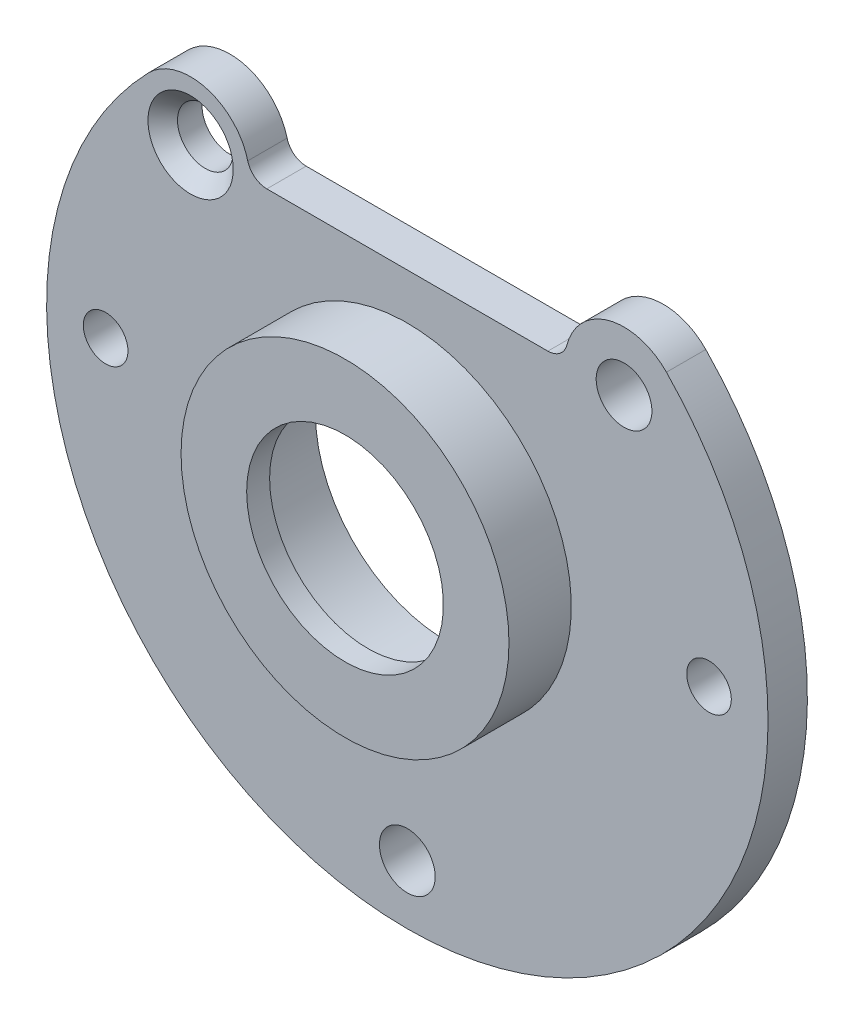
ISO-10303-21;
HEADER;
FILE_DESCRIPTION(('STEP AP214'),'2;1');
FILE_NAME('part.step','',(''),(''),'','','');
FILE_SCHEMA(('AUTOMOTIVE_DESIGN { 1 0 10303 214 1 1 1 1 }'));
ENDSEC;
DATA;
#1=APPLICATION_CONTEXT('core data for automotive mechanical design processes');
#2=APPLICATION_PROTOCOL_DEFINITION('international standard','automotive_design',2000,#1);
#3=PRODUCT_CONTEXT('',#1,'mechanical');
#4=PRODUCT('Part','Part','',(#3));
#5=PRODUCT_RELATED_PRODUCT_CATEGORY('part','',(#4));
#6=PRODUCT_DEFINITION_FORMATION('','',#4);
#7=PRODUCT_DEFINITION_CONTEXT('part definition',#1,'design');
#8=PRODUCT_DEFINITION('design','',#6,#7);
#9=PRODUCT_DEFINITION_SHAPE('','',#8);
#10=(LENGTH_UNIT() NAMED_UNIT(*) SI_UNIT(.MILLI.,.METRE.));
#11=(NAMED_UNIT(*) PLANE_ANGLE_UNIT() SI_UNIT($,.RADIAN.));
#12=(NAMED_UNIT(*) SI_UNIT($,.STERADIAN.) SOLID_ANGLE_UNIT());
#13=UNCERTAINTY_MEASURE_WITH_UNIT(LENGTH_MEASURE(1.E-05),#10,'distance_accuracy_value','');
#14=(GEOMETRIC_REPRESENTATION_CONTEXT(3) GLOBAL_UNCERTAINTY_ASSIGNED_CONTEXT((#13)) GLOBAL_UNIT_ASSIGNED_CONTEXT((#10,
#11,#12)) REPRESENTATION_CONTEXT('',''));
#15=CARTESIAN_POINT('',(0.,0.,0.));
#16=DIRECTION('',(0.,0.,1.));
#17=DIRECTION('',(1.,0.,0.));
#18=AXIS2_PLACEMENT_3D('',#15,#16,#17);
#19=CARTESIAN_POINT('',(-33.0454232837166,32.,6.));
#20=DIRECTION('',(0.,0.,-1.));
#21=DIRECTION('',(-1.,0.,0.));
#22=AXIS2_PLACEMENT_3D('',#19,#20,#21);
#23=PLANE('',#22);
#24=CARTESIAN_POINT('',(-33.0454232837166,32.,6.));
#25=DIRECTION('',(0.,0.,1.));
#26=DIRECTION('',(1.,0.,0.));
#27=AXIS2_PLACEMENT_3D('',#24,#25,#26);
#28=CIRCLE('',#27,6.5);
#29=CARTESIAN_POINT('',(-26.5454232837166,32.,6.));
#30=VERTEX_POINT('',#29);
#31=EDGE_CURVE('E257',#30,#30,#28,.T.);
#32=ORIENTED_EDGE('',*,*,#31,.F.);
#33=EDGE_LOOP('',(#32));
#34=FACE_BOUND('',#33,.T.);
#35=CARTESIAN_POINT('',(46.,0.,6.));
#36=DIRECTION('',(0.,0.,1.));
#37=DIRECTION('',(1.,0.,0.));
#38=AXIS2_PLACEMENT_3D('',#35,#36,#37);
#39=CIRCLE('',#38,3.39999999999999);
#40=CARTESIAN_POINT('',(49.4,0.,6.));
#41=VERTEX_POINT('',#40);
#42=EDGE_CURVE('E264',#41,#41,#39,.T.);
#43=ORIENTED_EDGE('',*,*,#42,.F.);
#44=EDGE_LOOP('',(#43));
#45=FACE_BOUND('',#44,.T.);
#46=CARTESIAN_POINT('',(0.,-46.,6.));
#47=DIRECTION('',(0.,0.,1.));
#48=DIRECTION('',(1.,0.,0.));
#49=AXIS2_PLACEMENT_3D('',#46,#47,#48);
#50=CIRCLE('',#49,4.25000000000001);
#51=CARTESIAN_POINT('',(4.25000000000001,-46.,6.));
#52=VERTEX_POINT('',#51);
#53=EDGE_CURVE('E152',#52,#52,#50,.T.);
#54=ORIENTED_EDGE('',*,*,#53,.F.);
#55=EDGE_LOOP('',(#54));
#56=FACE_BOUND('',#55,.T.);
#57=CARTESIAN_POINT('',(0.,0.,6.));
#58=DIRECTION('',(0.,0.,-1.));
#59=DIRECTION('',(-1.,0.,0.));
#60=AXIS2_PLACEMENT_3D('',#57,#58,#59);
#61=CIRCLE('',#60,25.);
#62=CARTESIAN_POINT('',(-25.,0.,6.));
#63=VERTEX_POINT('',#62);
#64=EDGE_CURVE('E11',#63,#63,#61,.F.);
#65=ORIENTED_EDGE('',*,*,#64,.F.);
#66=EDGE_LOOP('',(#65));
#67=FACE_BOUND('',#66,.T.);
#68=CARTESIAN_POINT('',(-33.0454232837166,32.,6.));
#69=DIRECTION('',(0.,0.,1.));
#70=DIRECTION('',(-1.,0.,0.));
#71=AXIS2_PLACEMENT_3D('',#68,#69,#70);
#72=CIRCLE('',#71,9.);
#73=CARTESIAN_POINT('',(-24.3312107547499,34.25,6.));
#74=VERTEX_POINT('',#73);
#75=CARTESIAN_POINT('',(-39.5108321870525,38.2608695652174,6.));
#76=VERTEX_POINT('',#75);
#77=EDGE_CURVE('E142',#74,#76,#72,.T.);
#78=ORIENTED_EDGE('',*,*,#77,.T.);
#79=CARTESIAN_POINT('',(0.,0.,6.));
#80=DIRECTION('',(0.,0.,1.));
#81=DIRECTION('',(1.,0.,0.));
#82=AXIS2_PLACEMENT_3D('',#79,#80,#81);
#83=CIRCLE('',#82,55.);
#84=CARTESIAN_POINT('',(39.5108321870525,38.2608695652174,6.));
#85=VERTEX_POINT('',#84);
#86=EDGE_CURVE('E100',#76,#85,#83,.T.);
#87=ORIENTED_EDGE('',*,*,#86,.T.);
#88=CARTESIAN_POINT('',(33.0454232837166,32.,6.));
#89=DIRECTION('',(0.,0.,1.));
#90=DIRECTION('',(1.,0.,0.));
#91=AXIS2_PLACEMENT_3D('',#88,#89,#90);
#92=CIRCLE('',#91,9.);
#93=CARTESIAN_POINT('',(24.3312107547499,34.25,6.));
#94=VERTEX_POINT('',#93);
#95=EDGE_CURVE('E113',#85,#94,#92,.T.);
#96=ORIENTED_EDGE('',*,*,#95,.T.);
#97=CARTESIAN_POINT('',(21.4264732450944,35.,6.));
#98=DIRECTION('',(0.,0.,-1.));
#99=DIRECTION('',(1.,0.,0.));
#100=AXIS2_PLACEMENT_3D('',#97,#98,#99);
#101=CIRCLE('',#100,3.);
#102=CARTESIAN_POINT('',(21.4264732450944,32.,6.));
#103=VERTEX_POINT('',#102);
#104=EDGE_CURVE('E107',#94,#103,#101,.T.);
#105=ORIENTED_EDGE('',*,*,#104,.T.);
#106=DIRECTION('',(-1.,0.,0.));
#107=VECTOR('',#106,1.);
#108=CARTESIAN_POINT('',(21.4264732450944,32.,6.));
#109=LINE('',#108,#107);
#110=CARTESIAN_POINT('',(-21.4264732450944,32.,6.));
#111=VERTEX_POINT('',#110);
#112=EDGE_CURVE('E111',#103,#111,#109,.T.);
#113=ORIENTED_EDGE('',*,*,#112,.T.);
#114=CARTESIAN_POINT('',(-21.4264732450944,35.,6.));
#115=DIRECTION('',(0.,0.,-1.));
#116=DIRECTION('',(1.,0.,0.));
#117=AXIS2_PLACEMENT_3D('',#114,#115,#116);
#118=CIRCLE('',#117,3.);
#119=EDGE_CURVE('E62',#111,#74,#118,.T.);
#120=ORIENTED_EDGE('',*,*,#119,.T.);
#121=EDGE_LOOP('',(#78,#87,#96,#105,#113,#120));
#122=FACE_BOUND('',#121,.T.);
#123=CARTESIAN_POINT('',(33.0454232837166,32.,6.));
#124=DIRECTION('',(0.,0.,1.));
#125=DIRECTION('',(1.,0.,0.));
#126=AXIS2_PLACEMENT_3D('',#123,#124,#125);
#127=CIRCLE('',#126,4.25000000000002);
#128=CARTESIAN_POINT('',(37.2954232837166,32.,6.));
#129=VERTEX_POINT('',#128);
#130=EDGE_CURVE('E163',#129,#129,#127,.T.);
#131=ORIENTED_EDGE('',*,*,#130,.F.);
#132=EDGE_LOOP('',(#131));
#133=FACE_BOUND('',#132,.T.);
#134=CARTESIAN_POINT('',(-46.,0.,6.));
#135=DIRECTION('',(0.,0.,1.));
#136=DIRECTION('',(1.,0.,0.));
#137=AXIS2_PLACEMENT_3D('',#134,#135,#136);
#138=CIRCLE('',#137,3.39999999999999);
#139=CARTESIAN_POINT('',(-42.6,0.,6.));
#140=VERTEX_POINT('',#139);
#141=EDGE_CURVE('E270',#140,#140,#138,.T.);
#142=ORIENTED_EDGE('',*,*,#141,.F.);
#143=EDGE_LOOP('',(#142));
#144=FACE_BOUND('',#143,.T.);
#145=ADVANCED_FACE('F43',(#34,#45,#56,#67,#122,#133,#144),#23,.F.);
#146=CARTESIAN_POINT('',(-33.0454232837166,32.,6.));
#147=DIRECTION('',(0.,0.,-1.));
#148=DIRECTION('',(-1.,0.,0.));
#149=AXIS2_PLACEMENT_3D('',#146,#147,#148);
#150=CYLINDRICAL_SURFACE('',#149,9.);
#151=CARTESIAN_POINT('',(-33.0454232837166,32.,0.));
#152=DIRECTION('',(0.,0.,1.));
#153=DIRECTION('',(-1.,0.,0.));
#154=AXIS2_PLACEMENT_3D('',#151,#152,#153);
#155=CIRCLE('',#154,9.);
#156=CARTESIAN_POINT('',(-24.3312107547499,34.25,0.));
#157=VERTEX_POINT('',#156);
#158=CARTESIAN_POINT('',(-39.5108321870525,38.2608695652174,0.));
#159=VERTEX_POINT('',#158);
#160=EDGE_CURVE('E131',#157,#159,#155,.T.);
#161=ORIENTED_EDGE('',*,*,#160,.T.);
#162=DIRECTION('',(0.,0.,-1.));
#163=VECTOR('',#162,1.);
#164=CARTESIAN_POINT('',(-39.5108321870525,38.2608695652174,6.));
#165=LINE('',#164,#163);
#166=EDGE_CURVE('E53',#76,#159,#165,.T.);
#167=ORIENTED_EDGE('',*,*,#166,.F.);
#168=ORIENTED_EDGE('',*,*,#77,.F.);
#169=DIRECTION('',(0.,0.,-1.));
#170=VECTOR('',#169,1.);
#171=CARTESIAN_POINT('',(-24.3312107547499,34.25,6.));
#172=LINE('',#171,#170);
#173=EDGE_CURVE('E127',#74,#157,#172,.T.);
#174=ORIENTED_EDGE('',*,*,#173,.T.);
#175=EDGE_LOOP('',(#161,#167,#168,#174));
#176=FACE_BOUND('',#175,.T.);
#177=ADVANCED_FACE('F45',(#176),#150,.T.);
#178=CARTESIAN_POINT('',(0.,0.,6.));
#179=DIRECTION('',(0.,0.,-1.));
#180=DIRECTION('',(-1.,0.,0.));
#181=AXIS2_PLACEMENT_3D('',#178,#179,#180);
#182=CYLINDRICAL_SURFACE('',#181,55.);
#183=CARTESIAN_POINT('',(0.,0.,0.));
#184=DIRECTION('',(0.,0.,1.));
#185=DIRECTION('',(1.,0.,0.));
#186=AXIS2_PLACEMENT_3D('',#183,#184,#185);
#187=CIRCLE('',#186,55.);
#188=CARTESIAN_POINT('',(39.5108321870525,38.2608695652174,0.));
#189=VERTEX_POINT('',#188);
#190=EDGE_CURVE('E134',#159,#189,#187,.T.);
#191=ORIENTED_EDGE('',*,*,#190,.T.);
#192=DIRECTION('',(0.,0.,-1.));
#193=VECTOR('',#192,1.);
#194=CARTESIAN_POINT('',(39.5108321870525,38.2608695652174,6.));
#195=LINE('',#194,#193);
#196=EDGE_CURVE('E146',#85,#189,#195,.T.);
#197=ORIENTED_EDGE('',*,*,#196,.F.);
#198=ORIENTED_EDGE('',*,*,#86,.F.);
#199=ORIENTED_EDGE('',*,*,#166,.T.);
#200=EDGE_LOOP('',(#191,#197,#198,#199));
#201=FACE_BOUND('',#200,.T.);
#202=ADVANCED_FACE('F180',(#201),#182,.T.);
#203=CARTESIAN_POINT('',(33.0454232837166,32.,6.));
#204=DIRECTION('',(0.,0.,-1.));
#205=DIRECTION('',(-1.,0.,0.));
#206=AXIS2_PLACEMENT_3D('',#203,#204,#205);
#207=CYLINDRICAL_SURFACE('',#206,9.);
#208=CARTESIAN_POINT('',(33.0454232837166,32.,0.));
#209=DIRECTION('',(0.,0.,1.));
#210=DIRECTION('',(1.,0.,0.));
#211=AXIS2_PLACEMENT_3D('',#208,#209,#210);
#212=CIRCLE('',#211,9.);
#213=CARTESIAN_POINT('',(24.3312107547499,34.25,0.));
#214=VERTEX_POINT('',#213);
#215=EDGE_CURVE('E137',#189,#214,#212,.T.);
#216=ORIENTED_EDGE('',*,*,#215,.T.);
#217=DIRECTION('',(0.,0.,-1.));
#218=VECTOR('',#217,1.);
#219=CARTESIAN_POINT('',(24.3312107547499,34.25,6.));
#220=LINE('',#219,#218);
#221=EDGE_CURVE('E122',#94,#214,#220,.T.);
#222=ORIENTED_EDGE('',*,*,#221,.F.);
#223=ORIENTED_EDGE('',*,*,#95,.F.);
#224=ORIENTED_EDGE('',*,*,#196,.T.);
#225=EDGE_LOOP('',(#216,#222,#223,#224));
#226=FACE_BOUND('',#225,.T.);
#227=ADVANCED_FACE('F183',(#226),#207,.T.);
#228=CARTESIAN_POINT('',(21.4264732450944,35.,6.));
#229=DIRECTION('',(0.,0.,-1.));
#230=DIRECTION('',(-1.,0.,0.));
#231=AXIS2_PLACEMENT_3D('',#228,#229,#230);
#232=CYLINDRICAL_SURFACE('',#231,3.);
#233=CARTESIAN_POINT('',(21.4264732450944,35.,0.));
#234=DIRECTION('',(0.,0.,-1.));
#235=DIRECTION('',(1.,0.,0.));
#236=AXIS2_PLACEMENT_3D('',#233,#234,#235);
#237=CIRCLE('',#236,3.);
#238=CARTESIAN_POINT('',(21.4264732450944,32.,0.));
#239=VERTEX_POINT('',#238);
#240=EDGE_CURVE('E121',#214,#239,#237,.T.);
#241=ORIENTED_EDGE('',*,*,#240,.T.);
#242=DIRECTION('',(0.,0.,-1.));
#243=VECTOR('',#242,1.);
#244=CARTESIAN_POINT('',(21.4264732450944,32.,6.));
#245=LINE('',#244,#243);
#246=EDGE_CURVE('E118',#103,#239,#245,.T.);
#247=ORIENTED_EDGE('',*,*,#246,.F.);
#248=ORIENTED_EDGE('',*,*,#104,.F.);
#249=ORIENTED_EDGE('',*,*,#221,.T.);
#250=EDGE_LOOP('',(#241,#247,#248,#249));
#251=FACE_BOUND('',#250,.T.);
#252=ADVANCED_FACE('F119',(#251),#232,.F.);
#253=CARTESIAN_POINT('',(21.4264732450944,32.,6.));
#254=DIRECTION('',(0.,-1.,0.));
#255=DIRECTION('',(0.,0.,-1.));
#256=AXIS2_PLACEMENT_3D('',#253,#254,#255);
#257=PLANE('',#256);
#258=DIRECTION('',(-1.,0.,0.));
#259=VECTOR('',#258,1.);
#260=CARTESIAN_POINT('',(21.4264732450944,32.,0.));
#261=LINE('',#260,#259);
#262=CARTESIAN_POINT('',(-21.4264732450944,32.,0.));
#263=VERTEX_POINT('',#262);
#264=EDGE_CURVE('E85',#239,#263,#261,.T.);
#265=ORIENTED_EDGE('',*,*,#264,.T.);
#266=DIRECTION('',(0.,0.,-1.));
#267=VECTOR('',#266,1.);
#268=CARTESIAN_POINT('',(-21.4264732450944,32.,6.));
#269=LINE('',#268,#267);
#270=EDGE_CURVE('E123',#111,#263,#269,.T.);
#271=ORIENTED_EDGE('',*,*,#270,.F.);
#272=ORIENTED_EDGE('',*,*,#112,.F.);
#273=ORIENTED_EDGE('',*,*,#246,.T.);
#274=EDGE_LOOP('',(#265,#271,#272,#273));
#275=FACE_BOUND('',#274,.T.);
#276=ADVANCED_FACE('F125',(#275),#257,.F.);
#277=CARTESIAN_POINT('',(-21.4264732450944,35.,6.));
#278=DIRECTION('',(0.,0.,-1.));
#279=DIRECTION('',(-1.,0.,0.));
#280=AXIS2_PLACEMENT_3D('',#277,#278,#279);
#281=CYLINDRICAL_SURFACE('',#280,3.);
#282=CARTESIAN_POINT('',(-21.4264732450944,35.,0.));
#283=DIRECTION('',(0.,0.,-1.));
#284=DIRECTION('',(1.,0.,0.));
#285=AXIS2_PLACEMENT_3D('',#282,#283,#284);
#286=CIRCLE('',#285,3.);
#287=EDGE_CURVE('E91',#263,#157,#286,.T.);
#288=ORIENTED_EDGE('',*,*,#287,.T.);
#289=ORIENTED_EDGE('',*,*,#173,.F.);
#290=ORIENTED_EDGE('',*,*,#119,.F.);
#291=ORIENTED_EDGE('',*,*,#270,.T.);
#292=EDGE_LOOP('',(#288,#289,#290,#291));
#293=FACE_BOUND('',#292,.T.);
#294=ADVANCED_FACE('F188',(#293),#281,.F.);
#295=CARTESIAN_POINT('',(-33.0454232837166,32.,0.));
#296=DIRECTION('',(0.,0.,-1.));
#297=DIRECTION('',(-1.,0.,0.));
#298=AXIS2_PLACEMENT_3D('',#295,#296,#297);
#299=PLANE('',#298);
#300=CARTESIAN_POINT('',(-33.0454232837166,32.,0.));
#301=DIRECTION('',(0.,0.,-1.));
#302=DIRECTION('',(-1.,0.,0.));
#303=AXIS2_PLACEMENT_3D('',#300,#301,#302);
#304=CIRCLE('',#303,4.24999999999999);
#305=CARTESIAN_POINT('',(-37.2954232837166,32.,0.));
#306=VERTEX_POINT('',#305);
#307=EDGE_CURVE('E259',#306,#306,#304,.T.);
#308=ORIENTED_EDGE('',*,*,#307,.F.);
#309=EDGE_LOOP('',(#308));
#310=FACE_BOUND('',#309,.T.);
#311=CARTESIAN_POINT('',(46.,0.,0.));
#312=DIRECTION('',(0.,0.,-1.));
#313=DIRECTION('',(-1.,0.,0.));
#314=AXIS2_PLACEMENT_3D('',#311,#312,#313);
#315=CIRCLE('',#314,3.39999999999999);
#316=CARTESIAN_POINT('',(42.6,0.,0.));
#317=VERTEX_POINT('',#316);
#318=EDGE_CURVE('E267',#317,#317,#315,.T.);
#319=ORIENTED_EDGE('',*,*,#318,.F.);
#320=EDGE_LOOP('',(#319));
#321=FACE_BOUND('',#320,.T.);
#322=CARTESIAN_POINT('',(-46.,0.,0.));
#323=DIRECTION('',(0.,0.,-1.));
#324=DIRECTION('',(-1.,0.,0.));
#325=AXIS2_PLACEMENT_3D('',#322,#323,#324);
#326=CIRCLE('',#325,3.39999999999999);
#327=CARTESIAN_POINT('',(-49.4,0.,0.));
#328=VERTEX_POINT('',#327);
#329=EDGE_CURVE('E272',#328,#328,#326,.T.);
#330=ORIENTED_EDGE('',*,*,#329,.F.);
#331=EDGE_LOOP('',(#330));
#332=FACE_BOUND('',#331,.T.);
#333=CARTESIAN_POINT('',(33.0454232837166,32.,0.));
#334=DIRECTION('',(0.,0.,-1.));
#335=DIRECTION('',(-1.,0.,0.));
#336=AXIS2_PLACEMENT_3D('',#333,#334,#335);
#337=CIRCLE('',#336,4.25000000000001);
#338=CARTESIAN_POINT('',(28.7954232837166,32.,0.));
#339=VERTEX_POINT('',#338);
#340=EDGE_CURVE('E47',#339,#339,#337,.T.);
#341=ORIENTED_EDGE('',*,*,#340,.F.);
#342=EDGE_LOOP('',(#341));
#343=FACE_BOUND('',#342,.T.);
#344=CARTESIAN_POINT('',(0.,-46.,0.));
#345=DIRECTION('',(0.,0.,-1.));
#346=DIRECTION('',(-1.,0.,0.));
#347=AXIS2_PLACEMENT_3D('',#344,#345,#346);
#348=CIRCLE('',#347,4.25000000000001);
#349=CARTESIAN_POINT('',(-4.25000000000001,-46.,0.));
#350=VERTEX_POINT('',#349);
#351=EDGE_CURVE('E149',#350,#350,#348,.T.);
#352=ORIENTED_EDGE('',*,*,#351,.F.);
#353=EDGE_LOOP('',(#352));
#354=FACE_BOUND('',#353,.T.);
#355=CARTESIAN_POINT('',(0.,0.,0.));
#356=DIRECTION('',(0.,0.,-1.));
#357=DIRECTION('',(-1.,0.,0.));
#358=AXIS2_PLACEMENT_3D('',#355,#356,#357);
#359=CIRCLE('',#358,20.);
#360=CARTESIAN_POINT('',(-20.,0.,0.));
#361=VERTEX_POINT('',#360);
#362=EDGE_CURVE('E168',#361,#361,#359,.T.);
#363=ORIENTED_EDGE('',*,*,#362,.F.);
#364=EDGE_LOOP('',(#363));
#365=FACE_BOUND('',#364,.T.);
#366=ORIENTED_EDGE('',*,*,#160,.F.);
#367=ORIENTED_EDGE('',*,*,#287,.F.);
#368=ORIENTED_EDGE('',*,*,#264,.F.);
#369=ORIENTED_EDGE('',*,*,#240,.F.);
#370=ORIENTED_EDGE('',*,*,#215,.F.);
#371=ORIENTED_EDGE('',*,*,#190,.F.);
#372=EDGE_LOOP('',(#366,#367,#368,#369,#370,#371));
#373=FACE_BOUND('',#372,.T.);
#374=ADVANCED_FACE('F186',(#310,#321,#332,#343,#354,#365,#373),#299,.T.);
#375=CARTESIAN_POINT('',(0.,0.,15.5));
#376=DIRECTION('',(0.,0.,-1.));
#377=DIRECTION('',(-1.,0.,0.));
#378=AXIS2_PLACEMENT_3D('',#375,#376,#377);
#379=CYLINDRICAL_SURFACE('',#378,25.);
#380=CARTESIAN_POINT('',(0.,0.,15.5));
#381=DIRECTION('',(0.,0.,1.));
#382=DIRECTION('',(1.,0.,0.));
#383=AXIS2_PLACEMENT_3D('',#380,#381,#382);
#384=CIRCLE('',#383,25.);
#385=CARTESIAN_POINT('',(25.,0.,15.5));
#386=VERTEX_POINT('',#385);
#387=EDGE_CURVE('E135',#386,#386,#384,.T.);
#388=ORIENTED_EDGE('',*,*,#387,.F.);
#389=EDGE_LOOP('',(#388));
#390=FACE_BOUND('',#389,.T.);
#391=ORIENTED_EDGE('',*,*,#64,.T.);
#392=EDGE_LOOP('',(#391));
#393=FACE_BOUND('',#392,.T.);
#394=ADVANCED_FACE('F196',(#390,#393),#379,.T.);
#395=CARTESIAN_POINT('',(0.,0.,15.5));
#396=DIRECTION('',(0.,0.,1.));
#397=DIRECTION('',(1.,0.,0.));
#398=AXIS2_PLACEMENT_3D('',#395,#396,#397);
#399=PLANE('',#398);
#400=CARTESIAN_POINT('',(0.,0.,15.5));
#401=DIRECTION('',(0.,0.,-1.));
#402=DIRECTION('',(-1.,0.,0.));
#403=AXIS2_PLACEMENT_3D('',#400,#401,#402);
#404=CIRCLE('',#403,15.);
#405=CARTESIAN_POINT('',(-15.,0.,15.5));
#406=VERTEX_POINT('',#405);
#407=EDGE_CURVE('E156',#406,#406,#404,.T.);
#408=ORIENTED_EDGE('',*,*,#407,.T.);
#409=EDGE_LOOP('',(#408));
#410=FACE_BOUND('',#409,.T.);
#411=ORIENTED_EDGE('',*,*,#387,.T.);
#412=EDGE_LOOP('',(#411));
#413=FACE_BOUND('',#412,.T.);
#414=ADVANCED_FACE('F211',(#410,#413),#399,.T.);
#415=CARTESIAN_POINT('',(0.,0.,12.));
#416=DIRECTION('',(0.,0.,-1.));
#417=DIRECTION('',(-1.,0.,0.));
#418=AXIS2_PLACEMENT_3D('',#415,#416,#417);
#419=CYLINDRICAL_SURFACE('',#418,20.);
#420=CARTESIAN_POINT('',(0.,0.,12.));
#421=DIRECTION('',(0.,0.,-1.));
#422=DIRECTION('',(-1.,0.,0.));
#423=AXIS2_PLACEMENT_3D('',#420,#421,#422);
#424=CIRCLE('',#423,20.);
#425=CARTESIAN_POINT('',(-20.,0.,12.));
#426=VERTEX_POINT('',#425);
#427=EDGE_CURVE('E170',#426,#426,#424,.T.);
#428=ORIENTED_EDGE('',*,*,#427,.F.);
#429=EDGE_LOOP('',(#428));
#430=FACE_BOUND('',#429,.T.);
#431=ORIENTED_EDGE('',*,*,#362,.T.);
#432=EDGE_LOOP('',(#431));
#433=FACE_BOUND('',#432,.T.);
#434=ADVANCED_FACE('F215',(#430,#433),#419,.F.);
#435=CARTESIAN_POINT('',(0.,0.,12.));
#436=DIRECTION('',(0.,0.,-1.));
#437=DIRECTION('',(-1.,0.,0.));
#438=AXIS2_PLACEMENT_3D('',#435,#436,#437);
#439=PLANE('',#438);
#440=CARTESIAN_POINT('',(0.,0.,12.));
#441=DIRECTION('',(0.,0.,-1.));
#442=DIRECTION('',(-1.,0.,0.));
#443=AXIS2_PLACEMENT_3D('',#440,#441,#442);
#444=CIRCLE('',#443,15.);
#445=CARTESIAN_POINT('',(-15.,0.,12.));
#446=VERTEX_POINT('',#445);
#447=EDGE_CURVE('E151',#446,#446,#444,.T.);
#448=ORIENTED_EDGE('',*,*,#447,.F.);
#449=EDGE_LOOP('',(#448));
#450=FACE_BOUND('',#449,.T.);
#451=ORIENTED_EDGE('',*,*,#427,.T.);
#452=EDGE_LOOP('',(#451));
#453=FACE_BOUND('',#452,.T.);
#454=ADVANCED_FACE('F219',(#450,#453),#439,.T.);
#455=CARTESIAN_POINT('',(0.,0.,15.5));
#456=DIRECTION('',(0.,0.,-1.));
#457=DIRECTION('',(-1.,0.,0.));
#458=AXIS2_PLACEMENT_3D('',#455,#456,#457);
#459=CYLINDRICAL_SURFACE('',#458,15.);
#460=CARTESIAN_POINT('',(-15.,0.,15.5));
#461=CARTESIAN_POINT('',(-15.,0.,15.4635416666667));
#462=CARTESIAN_POINT('',(-15.,0.,15.4270833333333));
#463=CARTESIAN_POINT('',(-15.,0.,15.3541666666667));
#464=CARTESIAN_POINT('',(-15.,0.,15.3177083333333));
#465=CARTESIAN_POINT('',(-15.,0.,15.2447916666667));
#466=CARTESIAN_POINT('',(-15.,0.,15.2083333333333));
#467=CARTESIAN_POINT('',(-15.,0.,15.1354166666667));
#468=CARTESIAN_POINT('',(-15.,0.,15.0989583333333));
#469=CARTESIAN_POINT('',(-15.,0.,15.0260416666667));
#470=CARTESIAN_POINT('',(-15.,0.,14.9895833333333));
#471=CARTESIAN_POINT('',(-15.,0.,14.9166666666667));
#472=CARTESIAN_POINT('',(-15.,0.,14.8802083333333));
#473=CARTESIAN_POINT('',(-15.,0.,14.8072916666667));
#474=CARTESIAN_POINT('',(-15.,0.,14.7708333333333));
#475=CARTESIAN_POINT('',(-15.,0.,14.6979166666667));
#476=CARTESIAN_POINT('',(-15.,0.,14.6614583333333));
#477=CARTESIAN_POINT('',(-15.,0.,14.5885416666667));
#478=CARTESIAN_POINT('',(-15.,0.,14.5520833333333));
#479=CARTESIAN_POINT('',(-15.,0.,14.4791666666667));
#480=CARTESIAN_POINT('',(-15.,0.,14.4427083333333));
#481=CARTESIAN_POINT('',(-15.,0.,14.3697916666667));
#482=CARTESIAN_POINT('',(-15.,0.,14.3333333333333));
#483=CARTESIAN_POINT('',(-15.,0.,14.2604166666667));
#484=CARTESIAN_POINT('',(-15.,0.,14.2239583333333));
#485=CARTESIAN_POINT('',(-15.,0.,14.1510416666667));
#486=CARTESIAN_POINT('',(-15.,0.,14.1145833333333));
#487=CARTESIAN_POINT('',(-15.,0.,14.0416666666667));
#488=CARTESIAN_POINT('',(-15.,0.,14.0052083333333));
#489=CARTESIAN_POINT('',(-15.,0.,13.9322916666667));
#490=CARTESIAN_POINT('',(-15.,0.,13.8958333333333));
#491=CARTESIAN_POINT('',(-15.,0.,13.8229166666667));
#492=CARTESIAN_POINT('',(-15.,0.,13.7864583333333));
#493=CARTESIAN_POINT('',(-15.,0.,13.7135416666667));
#494=CARTESIAN_POINT('',(-15.,0.,13.6770833333333));
#495=CARTESIAN_POINT('',(-15.,0.,13.6041666666667));
#496=CARTESIAN_POINT('',(-15.,0.,13.5677083333333));
#497=CARTESIAN_POINT('',(-15.,0.,13.4947916666667));
#498=CARTESIAN_POINT('',(-15.,0.,13.4583333333333));
#499=CARTESIAN_POINT('',(-15.,0.,13.3854166666667));
#500=CARTESIAN_POINT('',(-15.,0.,13.3489583333333));
#501=CARTESIAN_POINT('',(-15.,0.,13.2760416666667));
#502=CARTESIAN_POINT('',(-15.,0.,13.2395833333333));
#503=CARTESIAN_POINT('',(-15.,0.,13.1666666666667));
#504=CARTESIAN_POINT('',(-15.,0.,13.1302083333333));
#505=CARTESIAN_POINT('',(-15.,0.,13.0572916666667));
#506=CARTESIAN_POINT('',(-15.,0.,13.0208333333333));
#507=CARTESIAN_POINT('',(-15.,0.,12.9479166666667));
#508=CARTESIAN_POINT('',(-15.,0.,12.9114583333333));
#509=CARTESIAN_POINT('',(-15.,0.,12.8385416666667));
#510=CARTESIAN_POINT('',(-15.,0.,12.8020833333333));
#511=CARTESIAN_POINT('',(-15.,0.,12.7291666666667));
#512=CARTESIAN_POINT('',(-15.,0.,12.6927083333333));
#513=CARTESIAN_POINT('',(-15.,0.,12.6197916666667));
#514=CARTESIAN_POINT('',(-15.,0.,12.5833333333333));
#515=CARTESIAN_POINT('',(-15.,0.,12.5104166666667));
#516=CARTESIAN_POINT('',(-15.,0.,12.4739583333333));
#517=CARTESIAN_POINT('',(-15.,0.,12.4010416666667));
#518=CARTESIAN_POINT('',(-15.,0.,12.3645833333333));
#519=CARTESIAN_POINT('',(-15.,0.,12.2916666666667));
#520=CARTESIAN_POINT('',(-15.,0.,12.2552083333333));
#521=CARTESIAN_POINT('',(-15.,0.,12.1822916666667));
#522=CARTESIAN_POINT('',(-15.,0.,12.1458333333333));
#523=CARTESIAN_POINT('',(-15.,0.,12.0729166666667));
#524=CARTESIAN_POINT('',(-15.,0.,12.0364583333333));
#525=CARTESIAN_POINT('',(-15.,0.,12.));
#526=B_SPLINE_CURVE_WITH_KNOTS('',3,(#460,#461,#462,#463,#464,#465,#466,#467,#468,#469,#470,
#471,#472,#473,#474,#475,#476,#477,#478,#479,#480,#481,#482,#483,#484,#485,#486,#487,#488,#489,
#490,#491,#492,#493,#494,#495,#496,#497,#498,#499,#500,#501,#502,#503,#504,#505,#506,#507,#508,
#509,#510,#511,#512,#513,#514,#515,#516,#517,#518,#519,#520,#521,#522,#523,#524,#525),
.UNSPECIFIED.,.F.,.F.,(4,2,2,2,2,2,2,2,2,2,2,2,2,2,2,2,2,2,2,2,2,2,2,2,2,2,2,2,2,2,2,2,4),(0.,
0.109374999999998,0.218749999999998,0.328124999999999,0.437499999999999,0.546874999999999,
0.656249999999999,0.765624999999999,0.874999999999999,0.984374999999999,1.09375,1.203125,1.3125,
1.421875,1.53125,1.640625,1.75,1.859375,1.96875,2.078125,2.1875,2.296875,2.40625,2.515625,2.625,
2.734375,2.84375,2.953125,3.0625,3.171875,3.28125,3.390625,3.5),.UNSPECIFIED.);
#527=EDGE_CURVE('BSEAM223',#406,#446,#526,.T.);
#528=ORIENTED_EDGE('',*,*,#407,.F.);
#529=ORIENTED_EDGE('',*,*,#447,.T.);
#530=ORIENTED_EDGE('',*,*,#527,.T.);
#531=ORIENTED_EDGE('',*,*,#527,.F.);
#532=EDGE_LOOP('',(#528,#530,#529,#531));
#533=FACE_BOUND('',#532,.T.);
#534=ADVANCED_FACE('F223',(#533),#459,.F.);
#535=CARTESIAN_POINT('',(0.,-46.,6.));
#536=DIRECTION('',(0.,0.,1.));
#537=DIRECTION('',(1.,0.,0.));
#538=AXIS2_PLACEMENT_3D('',#535,#536,#537);
#539=CYLINDRICAL_SURFACE('',#538,4.25000000000001);
#540=ORIENTED_EDGE('',*,*,#351,.T.);
#541=EDGE_LOOP('',(#540));
#542=FACE_BOUND('',#541,.T.);
#543=ORIENTED_EDGE('',*,*,#53,.T.);
#544=EDGE_LOOP('',(#543));
#545=FACE_BOUND('',#544,.T.);
#546=ADVANCED_FACE('F227',(#542,#545),#539,.F.);
#547=CARTESIAN_POINT('',(33.0454232837166,32.,6.));
#548=DIRECTION('',(0.,0.,1.));
#549=DIRECTION('',(1.,0.,0.));
#550=AXIS2_PLACEMENT_3D('',#547,#548,#549);
#551=CYLINDRICAL_SURFACE('',#550,4.25000000000001);
#552=ORIENTED_EDGE('',*,*,#340,.T.);
#553=EDGE_LOOP('',(#552));
#554=FACE_BOUND('',#553,.T.);
#555=ORIENTED_EDGE('',*,*,#130,.T.);
#556=EDGE_LOOP('',(#555));
#557=FACE_BOUND('',#556,.T.);
#558=ADVANCED_FACE('F231',(#554,#557),#551,.F.);
#559=CARTESIAN_POINT('',(-46.,0.,6.));
#560=DIRECTION('',(0.,0.,1.));
#561=DIRECTION('',(1.,0.,0.));
#562=AXIS2_PLACEMENT_3D('',#559,#560,#561);
#563=CYLINDRICAL_SURFACE('',#562,3.39999999999999);
#564=ORIENTED_EDGE('',*,*,#141,.T.);
#565=EDGE_LOOP('',(#564));
#566=FACE_BOUND('',#565,.T.);
#567=ORIENTED_EDGE('',*,*,#329,.T.);
#568=EDGE_LOOP('',(#567));
#569=FACE_BOUND('',#568,.T.);
#570=ADVANCED_FACE('F234',(#566,#569),#563,.F.);
#571=CARTESIAN_POINT('',(46.,0.,6.));
#572=DIRECTION('',(0.,0.,1.));
#573=DIRECTION('',(1.,0.,0.));
#574=AXIS2_PLACEMENT_3D('',#571,#572,#573);
#575=CYLINDRICAL_SURFACE('',#574,3.39999999999999);
#576=ORIENTED_EDGE('',*,*,#42,.T.);
#577=EDGE_LOOP('',(#576));
#578=FACE_BOUND('',#577,.T.);
#579=ORIENTED_EDGE('',*,*,#318,.T.);
#580=EDGE_LOOP('',(#579));
#581=FACE_BOUND('',#580,.T.);
#582=ADVANCED_FACE('F238',(#578,#581),#575,.F.);
#583=CARTESIAN_POINT('',(-33.0454232837166,32.,6.));
#584=DIRECTION('',(0.,0.,1.));
#585=DIRECTION('',(1.,0.,0.));
#586=AXIS2_PLACEMENT_3D('',#583,#584,#585);
#587=CYLINDRICAL_SURFACE('',#586,4.24999999999999);
#588=CARTESIAN_POINT('',(-33.0454232837166,32.,3.75000000000001));
#589=DIRECTION('',(0.,0.,1.));
#590=DIRECTION('',(1.,0.,0.));
#591=AXIS2_PLACEMENT_3D('',#588,#589,#590);
#592=CIRCLE('',#591,4.24999999999999);
#593=CARTESIAN_POINT('',(-28.7954232837166,32.,3.75000000000001));
#594=VERTEX_POINT('',#593);
#595=EDGE_CURVE('E255',#594,#594,#592,.T.);
#596=ORIENTED_EDGE('',*,*,#595,.T.);
#597=EDGE_LOOP('',(#596));
#598=FACE_BOUND('',#597,.T.);
#599=ORIENTED_EDGE('',*,*,#307,.T.);
#600=EDGE_LOOP('',(#599));
#601=FACE_BOUND('',#600,.T.);
#602=ADVANCED_FACE('F242',(#598,#601),#587,.F.);
#603=CARTESIAN_POINT('',(-33.0454232837166,32.,6.));
#604=DIRECTION('',(0.,0.,1.));
#605=DIRECTION('',(1.,0.,0.));
#606=AXIS2_PLACEMENT_3D('',#603,#604,#605);
#607=CONICAL_SURFACE('',#606,6.5,0.785398163397453);
#608=ORIENTED_EDGE('',*,*,#595,.F.);
#609=EDGE_LOOP('',(#608));
#610=FACE_BOUND('',#609,.T.);
#611=ORIENTED_EDGE('',*,*,#31,.T.);
#612=EDGE_LOOP('',(#611));
#613=FACE_BOUND('',#612,.T.);
#614=ADVANCED_FACE('F246',(#610,#613),#607,.F.);
#615=CLOSED_SHELL('',(#145,#177,#202,#227,#252,#276,#294,#374,#394,#414,#434,#454,#534,#546,
#558,#570,#582,#602,#614));
#616=MANIFOLD_SOLID_BREP('B2',#615);
#617=ADVANCED_BREP_SHAPE_REPRESENTATION('',(#18,#616),#14);
#618=SHAPE_DEFINITION_REPRESENTATION(#9,#617);
ENDSEC;
END-ISO-10303-21;
